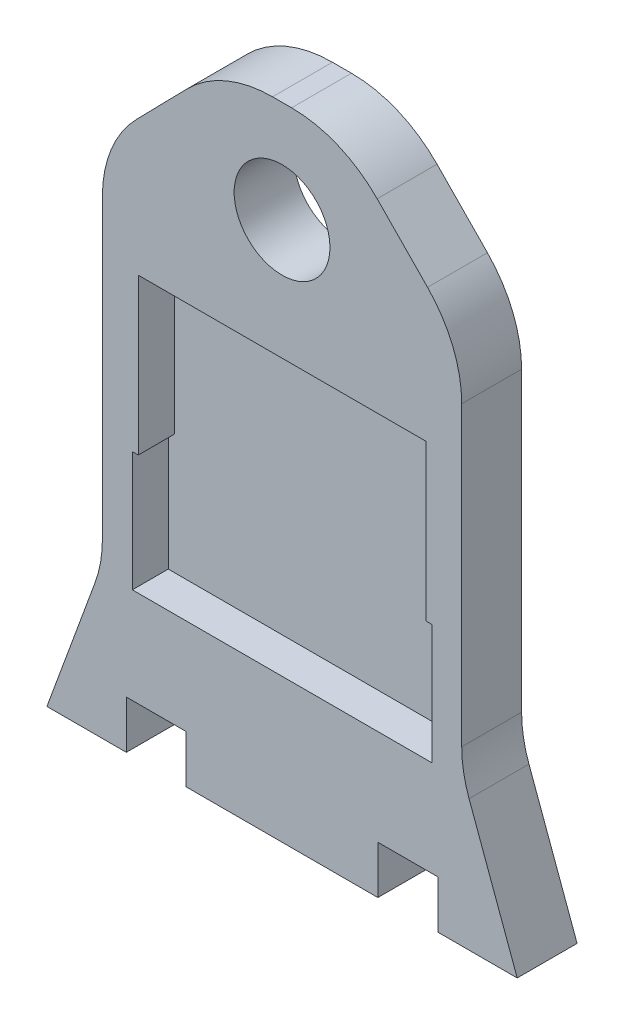
ISO-10303-21;
HEADER;
FILE_DESCRIPTION(('STEP AP214'),'2;1');
FILE_NAME('part.step','',(''),(''),'','','');
FILE_SCHEMA(('AUTOMOTIVE_DESIGN { 1 0 10303 214 1 1 1 1 }'));
ENDSEC;
DATA;
#1=APPLICATION_CONTEXT('core data for automotive mechanical design processes');
#2=APPLICATION_PROTOCOL_DEFINITION('international standard','automotive_design',2000,#1);
#3=PRODUCT_CONTEXT('',#1,'mechanical');
#4=PRODUCT('Part','Part','',(#3));
#5=PRODUCT_RELATED_PRODUCT_CATEGORY('part','',(#4));
#6=PRODUCT_DEFINITION_FORMATION('','',#4);
#7=PRODUCT_DEFINITION_CONTEXT('part definition',#1,'design');
#8=PRODUCT_DEFINITION('design','',#6,#7);
#9=PRODUCT_DEFINITION_SHAPE('','',#8);
#10=(LENGTH_UNIT() NAMED_UNIT(*) SI_UNIT(.MILLI.,.METRE.));
#11=(NAMED_UNIT(*) PLANE_ANGLE_UNIT() SI_UNIT($,.RADIAN.));
#12=(NAMED_UNIT(*) SI_UNIT($,.STERADIAN.) SOLID_ANGLE_UNIT());
#13=UNCERTAINTY_MEASURE_WITH_UNIT(LENGTH_MEASURE(1.E-05),#10,'distance_accuracy_value','');
#14=(GEOMETRIC_REPRESENTATION_CONTEXT(3) GLOBAL_UNCERTAINTY_ASSIGNED_CONTEXT((#13)) GLOBAL_UNIT_ASSIGNED_CONTEXT((#10,
#11,#12)) REPRESENTATION_CONTEXT('',''));
#15=CARTESIAN_POINT('',(0.,0.,0.));
#16=DIRECTION('',(0.,0.,1.));
#17=DIRECTION('',(1.,0.,0.));
#18=AXIS2_PLACEMENT_3D('',#15,#16,#17);
#19=CARTESIAN_POINT('',(0.,0.,5.));
#20=DIRECTION('',(0.,0.,-1.));
#21=DIRECTION('',(-1.,0.,0.));
#22=AXIS2_PLACEMENT_3D('',#19,#20,#21);
#23=PLANE('',#22);
#24=CARTESIAN_POINT('',(0.,12.5,5.));
#25=DIRECTION('',(0.,0.,1.));
#26=DIRECTION('',(1.,0.,0.));
#27=AXIS2_PLACEMENT_3D('',#24,#25,#26);
#28=CIRCLE('',#27,4.);
#29=CARTESIAN_POINT('',(4.,12.5,5.));
#30=VERTEX_POINT('',#29);
#31=EDGE_CURVE('E393',#30,#30,#28,.T.);
#32=ORIENTED_EDGE('',*,*,#31,.F.);
#33=EDGE_LOOP('',(#32));
#34=FACE_BOUND('',#33,.T.);
#35=DIRECTION('',(-0.344507703036126,0.938783490773444,0.));
#36=VECTOR('',#35,1.);
#37=CARTESIAN_POINT('',(15.,-19.875,5.));
#38=LINE('',#37,#36);
#39=CARTESIAN_POINT('',(19.6330275229358,-32.5,5.));
#40=VERTEX_POINT('',#39);
#41=CARTESIAN_POINT('',(15.6121650922656,-21.5431498764237,5.));
#42=VERTEX_POINT('',#41);
#43=EDGE_CURVE('E336',#40,#42,#38,.T.);
#44=ORIENTED_EDGE('',*,*,#43,.T.);
#45=CARTESIAN_POINT('',(25.,-18.0980728460624,5.));
#46=DIRECTION('',(0.,0.,-1.));
#47=DIRECTION('',(-1.,0.,0.));
#48=AXIS2_PLACEMENT_3D('',#45,#46,#47);
#49=CIRCLE('',#48,10.);
#50=CARTESIAN_POINT('',(15.,-18.0980728460624,5.));
#51=VERTEX_POINT('',#50);
#52=EDGE_CURVE('E45',#42,#51,#49,.T.);
#53=ORIENTED_EDGE('',*,*,#52,.T.);
#54=DIRECTION('',(0.,1.,0.));
#55=VECTOR('',#54,1.);
#56=CARTESIAN_POINT('',(15.,-33.5,5.));
#57=LINE('',#56,#55);
#58=CARTESIAN_POINT('',(15.,6.70234804023753,5.));
#59=VERTEX_POINT('',#58);
#60=EDGE_CURVE('E399',#51,#59,#57,.T.);
#61=ORIENTED_EDGE('',*,*,#60,.T.);
#62=CARTESIAN_POINT('',(5.,6.70234804023753,5.));
#63=DIRECTION('',(0.,0.,-1.));
#64=DIRECTION('',(-1.,0.,0.));
#65=AXIS2_PLACEMENT_3D('',#62,#63,#64);
#66=CIRCLE('',#65,10.);
#67=CARTESIAN_POINT('',(12.1471525735543,13.6965034638992,5.));
#68=VERTEX_POINT('',#67);
#69=EDGE_CURVE('E419',#59,#68,#66,.F.);
#70=ORIENTED_EDGE('',*,*,#69,.T.);
#71=DIRECTION('',(0.699415542366169,-0.714715257355429,0.));
#72=VECTOR('',#71,1.);
#73=CARTESIAN_POINT('',(15.,10.78125,5.));
#74=LINE('',#73,#72);
#75=CARTESIAN_POINT('',(7.94149927959712,17.9941554236617,5.));
#76=VERTEX_POINT('',#75);
#77=EDGE_CURVE('E331',#76,#68,#74,.T.);
#78=ORIENTED_EDGE('',*,*,#77,.F.);
#79=CARTESIAN_POINT('',(0.794346706042831,11.,5.));
#80=DIRECTION('',(0.,0.,-1.));
#81=DIRECTION('',(-1.,0.,0.));
#82=AXIS2_PLACEMENT_3D('',#79,#80,#81);
#83=CIRCLE('',#82,10.);
#84=CARTESIAN_POINT('',(0.794346706042831,21.,5.));
#85=VERTEX_POINT('',#84);
#86=EDGE_CURVE('E415',#76,#85,#83,.F.);
#87=ORIENTED_EDGE('',*,*,#86,.T.);
#88=DIRECTION('',(1.,0.,0.));
#89=VECTOR('',#88,1.);
#90=CARTESIAN_POINT('',(-15.,21.,5.));
#91=LINE('',#90,#89);
#92=CARTESIAN_POINT('',(-0.794346706042826,21.,5.));
#93=VERTEX_POINT('',#92);
#94=EDGE_CURVE('E365',#93,#85,#91,.T.);
#95=ORIENTED_EDGE('',*,*,#94,.F.);
#96=CARTESIAN_POINT('',(-0.794346706042825,11.,5.));
#97=DIRECTION('',(0.,0.,-1.));
#98=DIRECTION('',(-1.,0.,0.));
#99=AXIS2_PLACEMENT_3D('',#96,#97,#98);
#100=CIRCLE('',#99,10.);
#101=CARTESIAN_POINT('',(-7.94149927959712,17.9941554236617,5.));
#102=VERTEX_POINT('',#101);
#103=EDGE_CURVE('E413',#93,#102,#100,.F.);
#104=ORIENTED_EDGE('',*,*,#103,.T.);
#105=DIRECTION('',(0.699415542366169,0.714715257355429,0.));
#106=VECTOR('',#105,1.);
#107=CARTESIAN_POINT('',(-15.,10.78125,5.));
#108=LINE('',#107,#106);
#109=CARTESIAN_POINT('',(-12.1471525735543,13.6965034638992,5.));
#110=VERTEX_POINT('',#109);
#111=EDGE_CURVE('E328',#110,#102,#108,.T.);
#112=ORIENTED_EDGE('',*,*,#111,.F.);
#113=CARTESIAN_POINT('',(-5.,6.70234804023752,5.));
#114=DIRECTION('',(0.,0.,-1.));
#115=DIRECTION('',(-1.,0.,0.));
#116=AXIS2_PLACEMENT_3D('',#113,#114,#115);
#117=CIRCLE('',#116,10.);
#118=CARTESIAN_POINT('',(-15.,6.70234804023752,5.));
#119=VERTEX_POINT('',#118);
#120=EDGE_CURVE('E417',#110,#119,#117,.F.);
#121=ORIENTED_EDGE('',*,*,#120,.T.);
#122=DIRECTION('',(0.,-1.,0.));
#123=VECTOR('',#122,1.);
#124=CARTESIAN_POINT('',(-15.,-33.5,5.));
#125=LINE('',#124,#123);
#126=CARTESIAN_POINT('',(-15.,-18.0980728460624,5.));
#127=VERTEX_POINT('',#126);
#128=EDGE_CURVE('E401',#119,#127,#125,.T.);
#129=ORIENTED_EDGE('',*,*,#128,.T.);
#130=CARTESIAN_POINT('',(-25.,-18.0980728460624,5.));
#131=DIRECTION('',(0.,0.,-1.));
#132=DIRECTION('',(-1.,0.,0.));
#133=AXIS2_PLACEMENT_3D('',#130,#131,#132);
#134=CIRCLE('',#133,10.);
#135=CARTESIAN_POINT('',(-15.6121650922656,-21.5431498764237,5.));
#136=VERTEX_POINT('',#135);
#137=EDGE_CURVE('E457',#127,#136,#134,.T.);
#138=ORIENTED_EDGE('',*,*,#137,.T.);
#139=DIRECTION('',(-0.344507703036126,-0.938783490773444,0.));
#140=VECTOR('',#139,1.);
#141=CARTESIAN_POINT('',(-15.,-19.875,5.));
#142=LINE('',#141,#140);
#143=CARTESIAN_POINT('',(-19.6330275229358,-32.5,5.));
#144=VERTEX_POINT('',#143);
#145=EDGE_CURVE('E338',#136,#144,#142,.T.);
#146=ORIENTED_EDGE('',*,*,#145,.T.);
#147=DIRECTION('',(-1.,0.,0.));
#148=VECTOR('',#147,1.);
#149=CARTESIAN_POINT('',(-20.,-32.5,5.));
#150=LINE('',#149,#148);
#151=CARTESIAN_POINT('',(-13.,-32.5,5.));
#152=VERTEX_POINT('',#151);
#153=EDGE_CURVE('E287',#152,#144,#150,.T.);
#154=ORIENTED_EDGE('',*,*,#153,.F.);
#155=DIRECTION('',(0.,-1.,0.));
#156=VECTOR('',#155,1.);
#157=CARTESIAN_POINT('',(-13.,-33.5,5.));
#158=LINE('',#157,#156);
#159=CARTESIAN_POINT('',(-13.,-28.5,5.));
#160=VERTEX_POINT('',#159);
#161=EDGE_CURVE('E373',#160,#152,#158,.T.);
#162=ORIENTED_EDGE('',*,*,#161,.F.);
#163=DIRECTION('',(-1.,0.,0.));
#164=VECTOR('',#163,1.);
#165=CARTESIAN_POINT('',(-13.,-28.5,5.));
#166=LINE('',#165,#164);
#167=CARTESIAN_POINT('',(-8.,-28.5,5.));
#168=VERTEX_POINT('',#167);
#169=EDGE_CURVE('E376',#168,#160,#166,.T.);
#170=ORIENTED_EDGE('',*,*,#169,.F.);
#171=DIRECTION('',(0.,1.,0.));
#172=VECTOR('',#171,1.);
#173=CARTESIAN_POINT('',(-8.,-33.5,5.));
#174=LINE('',#173,#172);
#175=CARTESIAN_POINT('',(-8.,-32.5,5.));
#176=VERTEX_POINT('',#175);
#177=EDGE_CURVE('E359',#176,#168,#174,.T.);
#178=ORIENTED_EDGE('',*,*,#177,.F.);
#179=CARTESIAN_POINT('',(8.,-32.5,5.));
#180=VERTEX_POINT('',#179);
#181=EDGE_CURVE('E307',#180,#176,#150,.T.);
#182=ORIENTED_EDGE('',*,*,#181,.F.);
#183=DIRECTION('',(0.,-1.,0.));
#184=VECTOR('',#183,1.);
#185=CARTESIAN_POINT('',(8.,-33.5,5.));
#186=LINE('',#185,#184);
#187=CARTESIAN_POINT('',(8.,-28.5,5.));
#188=VERTEX_POINT('',#187);
#189=EDGE_CURVE('E355',#188,#180,#186,.T.);
#190=ORIENTED_EDGE('',*,*,#189,.F.);
#191=DIRECTION('',(-1.,0.,0.));
#192=VECTOR('',#191,1.);
#193=CARTESIAN_POINT('',(8.,-28.5,5.));
#194=LINE('',#193,#192);
#195=CARTESIAN_POINT('',(13.,-28.5,5.));
#196=VERTEX_POINT('',#195);
#197=EDGE_CURVE('E349',#196,#188,#194,.T.);
#198=ORIENTED_EDGE('',*,*,#197,.F.);
#199=DIRECTION('',(0.,1.,0.));
#200=VECTOR('',#199,1.);
#201=CARTESIAN_POINT('',(13.,-33.5,5.));
#202=LINE('',#201,#200);
#203=CARTESIAN_POINT('',(13.,-32.5,5.));
#204=VERTEX_POINT('',#203);
#205=EDGE_CURVE('E358',#204,#196,#202,.T.);
#206=ORIENTED_EDGE('',*,*,#205,.F.);
#207=EDGE_CURVE('E303',#40,#204,#150,.T.);
#208=ORIENTED_EDGE('',*,*,#207,.F.);
#209=EDGE_LOOP('',(#44,#53,#61,#70,#78,#87,#95,#104,#112,#121,#129,#138,#146,#154,#162,#170,
#178,#182,#190,#198,#206,#208));
#210=FACE_BOUND('',#209,.T.);
#211=DIRECTION('',(0.,-1.,0.));
#212=VECTOR('',#211,1.);
#213=CARTESIAN_POINT('',(12.,0.,5.));
#214=LINE('',#213,#212);
#215=CARTESIAN_POINT('',(12.,2.50000000000001,5.));
#216=VERTEX_POINT('',#215);
#217=CARTESIAN_POINT('',(12.,-10.5,5.));
#218=VERTEX_POINT('',#217);
#219=EDGE_CURVE('E52',#216,#218,#214,.T.);
#220=ORIENTED_EDGE('',*,*,#219,.T.);
#221=DIRECTION('',(1.,0.,0.));
#222=VECTOR('',#221,1.);
#223=CARTESIAN_POINT('',(0.,-10.5,5.));
#224=LINE('',#223,#222);
#225=CARTESIAN_POINT('',(12.5,-10.5,5.));
#226=VERTEX_POINT('',#225);
#227=EDGE_CURVE('E253',#218,#226,#224,.T.);
#228=ORIENTED_EDGE('',*,*,#227,.T.);
#229=DIRECTION('',(0.,1.,0.));
#230=VECTOR('',#229,1.);
#231=CARTESIAN_POINT('',(12.5,0.,5.));
#232=LINE('',#231,#230);
#233=CARTESIAN_POINT('',(12.5,-20.5,5.));
#234=VERTEX_POINT('',#233);
#235=EDGE_CURVE('E256',#234,#226,#232,.T.);
#236=ORIENTED_EDGE('',*,*,#235,.F.);
#237=DIRECTION('',(1.,0.,0.));
#238=VECTOR('',#237,1.);
#239=CARTESIAN_POINT('',(0.,-20.5,5.));
#240=LINE('',#239,#238);
#241=CARTESIAN_POINT('',(-12.5,-20.5,5.));
#242=VERTEX_POINT('',#241);
#243=EDGE_CURVE('E280',#242,#234,#240,.T.);
#244=ORIENTED_EDGE('',*,*,#243,.F.);
#245=DIRECTION('',(0.,1.,0.));
#246=VECTOR('',#245,1.);
#247=CARTESIAN_POINT('',(-12.5,0.,5.));
#248=LINE('',#247,#246);
#249=CARTESIAN_POINT('',(-12.5,-10.5,5.));
#250=VERTEX_POINT('',#249);
#251=EDGE_CURVE('E277',#242,#250,#248,.T.);
#252=ORIENTED_EDGE('',*,*,#251,.T.);
#253=CARTESIAN_POINT('',(-12.,-10.5,5.));
#254=VERTEX_POINT('',#253);
#255=EDGE_CURVE('E258',#250,#254,#224,.T.);
#256=ORIENTED_EDGE('',*,*,#255,.T.);
#257=DIRECTION('',(0.,-1.,0.));
#258=VECTOR('',#257,1.);
#259=CARTESIAN_POINT('',(-12.,0.,5.));
#260=LINE('',#259,#258);
#261=CARTESIAN_POINT('',(-12.,2.50000000000001,5.));
#262=VERTEX_POINT('',#261);
#263=EDGE_CURVE('E273',#262,#254,#260,.T.);
#264=ORIENTED_EDGE('',*,*,#263,.F.);
#265=DIRECTION('',(1.,0.,0.));
#266=VECTOR('',#265,1.);
#267=CARTESIAN_POINT('',(0.,2.50000000000001,5.));
#268=LINE('',#267,#266);
#269=EDGE_CURVE('E271',#262,#216,#268,.T.);
#270=ORIENTED_EDGE('',*,*,#269,.T.);
#271=EDGE_LOOP('',(#220,#228,#236,#244,#252,#256,#264,#270));
#272=FACE_BOUND('',#271,.T.);
#273=ADVANCED_FACE('F37',(#34,#210,#272),#23,.F.);
#274=CARTESIAN_POINT('',(15.,-33.5,5.));
#275=DIRECTION('',(-1.,0.,0.));
#276=DIRECTION('',(0.,0.,1.));
#277=AXIS2_PLACEMENT_3D('',#274,#275,#276);
#278=PLANE('',#277);
#279=ORIENTED_EDGE('',*,*,#60,.F.);
#280=DIRECTION('',(0.,0.,1.));
#281=VECTOR('',#280,1.);
#282=CARTESIAN_POINT('',(15.,-18.0980728460624,5.));
#283=LINE('',#282,#281);
#284=CARTESIAN_POINT('',(15.,-18.0980728460624,0.));
#285=VERTEX_POINT('',#284);
#286=EDGE_CURVE('E455',#51,#285,#283,.F.);
#287=ORIENTED_EDGE('',*,*,#286,.T.);
#288=DIRECTION('',(0.,1.,0.));
#289=VECTOR('',#288,1.);
#290=CARTESIAN_POINT('',(15.,-33.5,0.));
#291=LINE('',#290,#289);
#292=CARTESIAN_POINT('',(15.,6.70234804023753,0.));
#293=VERTEX_POINT('',#292);
#294=EDGE_CURVE('E396',#285,#293,#291,.T.);
#295=ORIENTED_EDGE('',*,*,#294,.T.);
#296=DIRECTION('',(0.,0.,1.));
#297=VECTOR('',#296,1.);
#298=CARTESIAN_POINT('',(15.,6.70234804023753,5.));
#299=LINE('',#298,#297);
#300=EDGE_CURVE('E410',#293,#59,#299,.T.);
#301=ORIENTED_EDGE('',*,*,#300,.T.);
#302=EDGE_LOOP('',(#279,#287,#295,#301));
#303=FACE_BOUND('',#302,.T.);
#304=ADVANCED_FACE('F528',(#303),#278,.F.);
#305=CARTESIAN_POINT('',(0.,0.,0.));
#306=DIRECTION('',(0.,0.,-1.));
#307=DIRECTION('',(-1.,0.,0.));
#308=AXIS2_PLACEMENT_3D('',#305,#306,#307);
#309=PLANE('',#308);
#310=DIRECTION('',(0.699415542366169,-0.714715257355429,0.));
#311=VECTOR('',#310,1.);
#312=CARTESIAN_POINT('',(15.,10.78125,0.));
#313=LINE('',#312,#311);
#314=CARTESIAN_POINT('',(7.94149927959712,17.9941554236617,0.));
#315=VERTEX_POINT('',#314);
#316=CARTESIAN_POINT('',(12.1471525735543,13.6965034638992,0.));
#317=VERTEX_POINT('',#316);
#318=EDGE_CURVE('E323',#315,#317,#313,.T.);
#319=ORIENTED_EDGE('',*,*,#318,.T.);
#320=CARTESIAN_POINT('',(5.,6.70234804023753,0.));
#321=DIRECTION('',(0.,0.,-1.));
#322=DIRECTION('',(-1.,0.,0.));
#323=AXIS2_PLACEMENT_3D('',#320,#321,#322);
#324=CIRCLE('',#323,10.);
#325=EDGE_CURVE('E432',#317,#293,#324,.T.);
#326=ORIENTED_EDGE('',*,*,#325,.T.);
#327=ORIENTED_EDGE('',*,*,#294,.F.);
#328=CARTESIAN_POINT('',(25.,-18.0980728460624,0.));
#329=DIRECTION('',(0.,0.,-1.));
#330=DIRECTION('',(-1.,0.,0.));
#331=AXIS2_PLACEMENT_3D('',#328,#329,#330);
#332=CIRCLE('',#331,10.);
#333=CARTESIAN_POINT('',(15.6121650922656,-21.5431498764237,0.));
#334=VERTEX_POINT('',#333);
#335=EDGE_CURVE('E11',#285,#334,#332,.F.);
#336=ORIENTED_EDGE('',*,*,#335,.T.);
#337=DIRECTION('',(-0.344507703036126,0.938783490773444,0.));
#338=VECTOR('',#337,1.);
#339=CARTESIAN_POINT('',(15.,-19.875,0.));
#340=LINE('',#339,#338);
#341=CARTESIAN_POINT('',(19.6330275229358,-32.5,0.));
#342=VERTEX_POINT('',#341);
#343=EDGE_CURVE('E327',#342,#334,#340,.T.);
#344=ORIENTED_EDGE('',*,*,#343,.F.);
#345=DIRECTION('',(-1.,0.,0.));
#346=VECTOR('',#345,1.);
#347=CARTESIAN_POINT('',(-20.,-32.5,0.));
#348=LINE('',#347,#346);
#349=CARTESIAN_POINT('',(13.,-32.5,0.));
#350=VERTEX_POINT('',#349);
#351=EDGE_CURVE('E304',#342,#350,#348,.T.);
#352=ORIENTED_EDGE('',*,*,#351,.T.);
#353=DIRECTION('',(0.,1.,0.));
#354=VECTOR('',#353,1.);
#355=CARTESIAN_POINT('',(13.,-33.5,0.));
#356=LINE('',#355,#354);
#357=CARTESIAN_POINT('',(13.,-28.5,0.));
#358=VERTEX_POINT('',#357);
#359=EDGE_CURVE('E348',#350,#358,#356,.T.);
#360=ORIENTED_EDGE('',*,*,#359,.T.);
#361=DIRECTION('',(-1.,0.,0.));
#362=VECTOR('',#361,1.);
#363=CARTESIAN_POINT('',(8.,-28.5,0.));
#364=LINE('',#363,#362);
#365=CARTESIAN_POINT('',(8.,-28.5,0.));
#366=VERTEX_POINT('',#365);
#367=EDGE_CURVE('E351',#358,#366,#364,.T.);
#368=ORIENTED_EDGE('',*,*,#367,.T.);
#369=DIRECTION('',(0.,-1.,0.));
#370=VECTOR('',#369,1.);
#371=CARTESIAN_POINT('',(8.,-33.5,0.));
#372=LINE('',#371,#370);
#373=CARTESIAN_POINT('',(8.,-32.5,0.));
#374=VERTEX_POINT('',#373);
#375=EDGE_CURVE('E345',#366,#374,#372,.T.);
#376=ORIENTED_EDGE('',*,*,#375,.T.);
#377=CARTESIAN_POINT('',(-8.,-32.5,0.));
#378=VERTEX_POINT('',#377);
#379=EDGE_CURVE('E302',#374,#378,#348,.T.);
#380=ORIENTED_EDGE('',*,*,#379,.T.);
#381=DIRECTION('',(0.,1.,0.));
#382=VECTOR('',#381,1.);
#383=CARTESIAN_POINT('',(-8.,-33.5,0.));
#384=LINE('',#383,#382);
#385=CARTESIAN_POINT('',(-8.,-28.5,0.));
#386=VERTEX_POINT('',#385);
#387=EDGE_CURVE('E377',#378,#386,#384,.T.);
#388=ORIENTED_EDGE('',*,*,#387,.T.);
#389=DIRECTION('',(-1.,0.,0.));
#390=VECTOR('',#389,1.);
#391=CARTESIAN_POINT('',(-13.,-28.5,0.));
#392=LINE('',#391,#390);
#393=CARTESIAN_POINT('',(-13.,-28.5,0.));
#394=VERTEX_POINT('',#393);
#395=EDGE_CURVE('E383',#386,#394,#392,.T.);
#396=ORIENTED_EDGE('',*,*,#395,.T.);
#397=DIRECTION('',(0.,-1.,0.));
#398=VECTOR('',#397,1.);
#399=CARTESIAN_POINT('',(-13.,-33.5,0.));
#400=LINE('',#399,#398);
#401=CARTESIAN_POINT('',(-13.,-32.5,0.));
#402=VERTEX_POINT('',#401);
#403=EDGE_CURVE('E371',#394,#402,#400,.T.);
#404=ORIENTED_EDGE('',*,*,#403,.T.);
#405=CARTESIAN_POINT('',(-19.6330275229358,-32.5,0.));
#406=VERTEX_POINT('',#405);
#407=EDGE_CURVE('E299',#402,#406,#348,.T.);
#408=ORIENTED_EDGE('',*,*,#407,.T.);
#409=DIRECTION('',(-0.344507703036126,-0.938783490773444,0.));
#410=VECTOR('',#409,1.);
#411=CARTESIAN_POINT('',(-15.,-19.875,0.));
#412=LINE('',#411,#410);
#413=CARTESIAN_POINT('',(-15.6121650922656,-21.5431498764237,0.));
#414=VERTEX_POINT('',#413);
#415=EDGE_CURVE('E341',#414,#406,#412,.T.);
#416=ORIENTED_EDGE('',*,*,#415,.F.);
#417=CARTESIAN_POINT('',(-25.,-18.0980728460624,0.));
#418=DIRECTION('',(0.,0.,-1.));
#419=DIRECTION('',(-1.,0.,0.));
#420=AXIS2_PLACEMENT_3D('',#417,#418,#419);
#421=CIRCLE('',#420,10.);
#422=CARTESIAN_POINT('',(-15.,-18.0980728460624,0.));
#423=VERTEX_POINT('',#422);
#424=EDGE_CURVE('E459',#414,#423,#421,.F.);
#425=ORIENTED_EDGE('',*,*,#424,.T.);
#426=DIRECTION('',(0.,-1.,0.));
#427=VECTOR('',#426,1.);
#428=CARTESIAN_POINT('',(-15.,-33.5,0.));
#429=LINE('',#428,#427);
#430=CARTESIAN_POINT('',(-15.,6.70234804023752,0.));
#431=VERTEX_POINT('',#430);
#432=EDGE_CURVE('E402',#431,#423,#429,.T.);
#433=ORIENTED_EDGE('',*,*,#432,.F.);
#434=CARTESIAN_POINT('',(-5.,6.70234804023752,0.));
#435=DIRECTION('',(0.,0.,-1.));
#436=DIRECTION('',(-1.,0.,0.));
#437=AXIS2_PLACEMENT_3D('',#434,#435,#436);
#438=CIRCLE('',#437,10.);
#439=CARTESIAN_POINT('',(-12.1471525735543,13.6965034638992,0.));
#440=VERTEX_POINT('',#439);
#441=EDGE_CURVE('E430',#431,#440,#438,.T.);
#442=ORIENTED_EDGE('',*,*,#441,.T.);
#443=DIRECTION('',(0.699415542366169,0.714715257355429,0.));
#444=VECTOR('',#443,1.);
#445=CARTESIAN_POINT('',(-15.,10.78125,0.));
#446=LINE('',#445,#444);
#447=CARTESIAN_POINT('',(-7.94149927959712,17.9941554236617,0.));
#448=VERTEX_POINT('',#447);
#449=EDGE_CURVE('E324',#440,#448,#446,.T.);
#450=ORIENTED_EDGE('',*,*,#449,.T.);
#451=CARTESIAN_POINT('',(-0.794346706042825,11.,0.));
#452=DIRECTION('',(0.,0.,-1.));
#453=DIRECTION('',(-1.,0.,0.));
#454=AXIS2_PLACEMENT_3D('',#451,#452,#453);
#455=CIRCLE('',#454,10.);
#456=CARTESIAN_POINT('',(-0.794346706042826,21.,0.));
#457=VERTEX_POINT('',#456);
#458=EDGE_CURVE('E426',#448,#457,#455,.T.);
#459=ORIENTED_EDGE('',*,*,#458,.T.);
#460=DIRECTION('',(1.,0.,0.));
#461=VECTOR('',#460,1.);
#462=CARTESIAN_POINT('',(-15.,21.,0.));
#463=LINE('',#462,#461);
#464=CARTESIAN_POINT('',(0.794346706042831,21.,0.));
#465=VERTEX_POINT('',#464);
#466=EDGE_CURVE('E387',#457,#465,#463,.T.);
#467=ORIENTED_EDGE('',*,*,#466,.T.);
#468=CARTESIAN_POINT('',(0.794346706042831,11.,0.));
#469=DIRECTION('',(0.,0.,-1.));
#470=DIRECTION('',(-1.,0.,0.));
#471=AXIS2_PLACEMENT_3D('',#468,#469,#470);
#472=CIRCLE('',#471,10.);
#473=EDGE_CURVE('E428',#465,#315,#472,.T.);
#474=ORIENTED_EDGE('',*,*,#473,.T.);
#475=EDGE_LOOP('',(#319,#326,#327,#336,#344,#352,#360,#368,#376,#380,#388,#396,#404,#408,#416,
#425,#433,#442,#450,#459,#467,#474));
#476=FACE_BOUND('',#475,.T.);
#477=CARTESIAN_POINT('',(0.,12.5,0.));
#478=DIRECTION('',(0.,0.,1.));
#479=DIRECTION('',(1.,0.,0.));
#480=AXIS2_PLACEMENT_3D('',#477,#478,#479);
#481=CIRCLE('',#480,4.);
#482=CARTESIAN_POINT('',(4.,12.5,0.));
#483=VERTEX_POINT('',#482);
#484=EDGE_CURVE('E390',#483,#483,#481,.T.);
#485=ORIENTED_EDGE('',*,*,#484,.T.);
#486=EDGE_LOOP('',(#485));
#487=FACE_BOUND('',#486,.T.);
#488=ADVANCED_FACE('F464',(#476,#487),#309,.T.);
#489=CARTESIAN_POINT('',(-15.,-33.5,5.));
#490=DIRECTION('',(1.,0.,0.));
#491=DIRECTION('',(0.,0.,-1.));
#492=AXIS2_PLACEMENT_3D('',#489,#490,#491);
#493=PLANE('',#492);
#494=ORIENTED_EDGE('',*,*,#432,.T.);
#495=DIRECTION('',(0.,0.,1.));
#496=VECTOR('',#495,1.);
#497=CARTESIAN_POINT('',(-15.,-18.0980728460624,5.));
#498=LINE('',#497,#496);
#499=EDGE_CURVE('E447',#423,#127,#498,.T.);
#500=ORIENTED_EDGE('',*,*,#499,.T.);
#501=ORIENTED_EDGE('',*,*,#128,.F.);
#502=DIRECTION('',(0.,0.,1.));
#503=VECTOR('',#502,1.);
#504=CARTESIAN_POINT('',(-15.,6.70234804023752,5.));
#505=LINE('',#504,#503);
#506=EDGE_CURVE('E440',#119,#431,#505,.F.);
#507=ORIENTED_EDGE('',*,*,#506,.T.);
#508=EDGE_LOOP('',(#494,#500,#501,#507));
#509=FACE_BOUND('',#508,.T.);
#510=ADVANCED_FACE('F471',(#509),#493,.F.);
#511=CARTESIAN_POINT('',(0.,12.5,5.));
#512=DIRECTION('',(0.,0.,-1.));
#513=DIRECTION('',(-1.,0.,0.));
#514=AXIS2_PLACEMENT_3D('',#511,#512,#513);
#515=CYLINDRICAL_SURFACE('',#514,4.);
#516=ORIENTED_EDGE('',*,*,#31,.T.);
#517=EDGE_LOOP('',(#516));
#518=FACE_BOUND('',#517,.T.);
#519=ORIENTED_EDGE('',*,*,#484,.F.);
#520=EDGE_LOOP('',(#519));
#521=FACE_BOUND('',#520,.T.);
#522=ADVANCED_FACE('F580',(#518,#521),#515,.F.);
#523=CARTESIAN_POINT('',(-15.,21.,0.));
#524=DIRECTION('',(0.,-1.,0.));
#525=DIRECTION('',(1.,0.,0.));
#526=AXIS2_PLACEMENT_3D('',#523,#524,#525);
#527=PLANE('',#526);
#528=ORIENTED_EDGE('',*,*,#94,.T.);
#529=DIRECTION('',(0.,0.,1.));
#530=VECTOR('',#529,1.);
#531=CARTESIAN_POINT('',(0.794346706042831,21.,0.));
#532=LINE('',#531,#530);
#533=EDGE_CURVE('E445',#85,#465,#532,.F.);
#534=ORIENTED_EDGE('',*,*,#533,.T.);
#535=ORIENTED_EDGE('',*,*,#466,.F.);
#536=DIRECTION('',(0.,0.,1.));
#537=VECTOR('',#536,1.);
#538=CARTESIAN_POINT('',(-0.794346706042826,21.,0.));
#539=LINE('',#538,#537);
#540=EDGE_CURVE('E442',#457,#93,#539,.T.);
#541=ORIENTED_EDGE('',*,*,#540,.T.);
#542=EDGE_LOOP('',(#528,#534,#535,#541));
#543=FACE_BOUND('',#542,.T.);
#544=ADVANCED_FACE('F546',(#543),#527,.F.);
#545=CARTESIAN_POINT('',(-8.,-33.5,0.));
#546=DIRECTION('',(1.,0.,0.));
#547=DIRECTION('',(0.,0.,-1.));
#548=AXIS2_PLACEMENT_3D('',#545,#546,#547);
#549=PLANE('',#548);
#550=ORIENTED_EDGE('',*,*,#387,.F.);
#551=DIRECTION('',(0.,0.,1.));
#552=VECTOR('',#551,1.);
#553=CARTESIAN_POINT('',(-8.,-32.5,0.));
#554=LINE('',#553,#552);
#555=EDGE_CURVE('E320',#378,#176,#554,.T.);
#556=ORIENTED_EDGE('',*,*,#555,.T.);
#557=ORIENTED_EDGE('',*,*,#177,.T.);
#558=DIRECTION('',(0.,0.,1.));
#559=VECTOR('',#558,1.);
#560=CARTESIAN_POINT('',(-8.,-28.5,0.));
#561=LINE('',#560,#559);
#562=EDGE_CURVE('E368',#386,#168,#561,.T.);
#563=ORIENTED_EDGE('',*,*,#562,.F.);
#564=EDGE_LOOP('',(#550,#556,#557,#563));
#565=FACE_BOUND('',#564,.T.);
#566=ADVANCED_FACE('F496',(#565),#549,.F.);
#567=CARTESIAN_POINT('',(-13.,-33.5,0.));
#568=DIRECTION('',(-1.,0.,0.));
#569=DIRECTION('',(0.,0.,1.));
#570=AXIS2_PLACEMENT_3D('',#567,#568,#569);
#571=PLANE('',#570);
#572=ORIENTED_EDGE('',*,*,#161,.T.);
#573=DIRECTION('',(0.,0.,-1.));
#574=VECTOR('',#573,1.);
#575=CARTESIAN_POINT('',(-13.,-32.5,0.));
#576=LINE('',#575,#574);
#577=EDGE_CURVE('E317',#152,#402,#576,.T.);
#578=ORIENTED_EDGE('',*,*,#577,.T.);
#579=ORIENTED_EDGE('',*,*,#403,.F.);
#580=DIRECTION('',(0.,0.,1.));
#581=VECTOR('',#580,1.);
#582=CARTESIAN_POINT('',(-13.,-28.5,0.));
#583=LINE('',#582,#581);
#584=EDGE_CURVE('E343',#394,#160,#583,.T.);
#585=ORIENTED_EDGE('',*,*,#584,.T.);
#586=EDGE_LOOP('',(#572,#578,#579,#585));
#587=FACE_BOUND('',#586,.T.);
#588=ADVANCED_FACE('F486',(#587),#571,.F.);
#589=CARTESIAN_POINT('',(-13.,-28.5,0.));
#590=DIRECTION('',(0.,1.,0.));
#591=DIRECTION('',(0.,0.,1.));
#592=AXIS2_PLACEMENT_3D('',#589,#590,#591);
#593=PLANE('',#592);
#594=ORIENTED_EDGE('',*,*,#169,.T.);
#595=ORIENTED_EDGE('',*,*,#584,.F.);
#596=ORIENTED_EDGE('',*,*,#395,.F.);
#597=ORIENTED_EDGE('',*,*,#562,.T.);
#598=EDGE_LOOP('',(#594,#595,#596,#597));
#599=FACE_BOUND('',#598,.T.);
#600=ADVANCED_FACE('F492',(#599),#593,.F.);
#601=CARTESIAN_POINT('',(8.,-33.5,0.));
#602=DIRECTION('',(-1.,0.,0.));
#603=DIRECTION('',(0.,0.,1.));
#604=AXIS2_PLACEMENT_3D('',#601,#602,#603);
#605=PLANE('',#604);
#606=ORIENTED_EDGE('',*,*,#189,.T.);
#607=DIRECTION('',(0.,0.,-1.));
#608=VECTOR('',#607,1.);
#609=CARTESIAN_POINT('',(8.,-32.5,0.));
#610=LINE('',#609,#608);
#611=EDGE_CURVE('E314',#180,#374,#610,.T.);
#612=ORIENTED_EDGE('',*,*,#611,.T.);
#613=ORIENTED_EDGE('',*,*,#375,.F.);
#614=DIRECTION('',(0.,0.,1.));
#615=VECTOR('',#614,1.);
#616=CARTESIAN_POINT('',(8.,-28.5,0.));
#617=LINE('',#616,#615);
#618=EDGE_CURVE('E363',#366,#188,#617,.T.);
#619=ORIENTED_EDGE('',*,*,#618,.T.);
#620=EDGE_LOOP('',(#606,#612,#613,#619));
#621=FACE_BOUND('',#620,.T.);
#622=ADVANCED_FACE('F516',(#621),#605,.F.);
#623=CARTESIAN_POINT('',(8.,-28.5,0.));
#624=DIRECTION('',(0.,1.,0.));
#625=DIRECTION('',(0.,0.,1.));
#626=AXIS2_PLACEMENT_3D('',#623,#624,#625);
#627=PLANE('',#626);
#628=ORIENTED_EDGE('',*,*,#197,.T.);
#629=ORIENTED_EDGE('',*,*,#618,.F.);
#630=ORIENTED_EDGE('',*,*,#367,.F.);
#631=DIRECTION('',(0.,0.,1.));
#632=VECTOR('',#631,1.);
#633=CARTESIAN_POINT('',(13.,-28.5,0.));
#634=LINE('',#633,#632);
#635=EDGE_CURVE('E354',#358,#196,#634,.T.);
#636=ORIENTED_EDGE('',*,*,#635,.T.);
#637=EDGE_LOOP('',(#628,#629,#630,#636));
#638=FACE_BOUND('',#637,.T.);
#639=ADVANCED_FACE('F513',(#638),#627,.F.);
#640=CARTESIAN_POINT('',(13.,-33.5,0.));
#641=DIRECTION('',(1.,0.,0.));
#642=DIRECTION('',(0.,0.,-1.));
#643=AXIS2_PLACEMENT_3D('',#640,#641,#642);
#644=PLANE('',#643);
#645=ORIENTED_EDGE('',*,*,#359,.F.);
#646=DIRECTION('',(0.,0.,1.));
#647=VECTOR('',#646,1.);
#648=CARTESIAN_POINT('',(13.,-32.5,0.));
#649=LINE('',#648,#647);
#650=EDGE_CURVE('E311',#350,#204,#649,.T.);
#651=ORIENTED_EDGE('',*,*,#650,.T.);
#652=ORIENTED_EDGE('',*,*,#205,.T.);
#653=ORIENTED_EDGE('',*,*,#635,.F.);
#654=EDGE_LOOP('',(#645,#651,#652,#653));
#655=FACE_BOUND('',#654,.T.);
#656=ADVANCED_FACE('F508',(#655),#644,.F.);
#657=CARTESIAN_POINT('',(-15.,-19.875,0.));
#658=DIRECTION('',(-0.938783490773444,0.344507703036126,0.));
#659=DIRECTION('',(-0.344507703036126,-0.938783490773444,0.));
#660=AXIS2_PLACEMENT_3D('',#657,#658,#659);
#661=PLANE('',#660);
#662=ORIENTED_EDGE('',*,*,#145,.F.);
#663=DIRECTION('',(0.,0.,1.));
#664=VECTOR('',#663,1.);
#665=CARTESIAN_POINT('',(-15.6121650922656,-21.5431498764237,0.));
#666=LINE('',#665,#664);
#667=EDGE_CURVE('E450',#136,#414,#666,.F.);
#668=ORIENTED_EDGE('',*,*,#667,.T.);
#669=ORIENTED_EDGE('',*,*,#415,.T.);
#670=DIRECTION('',(0.,0.,-1.));
#671=VECTOR('',#670,1.);
#672=CARTESIAN_POINT('',(-19.6330275229358,-32.5,0.));
#673=LINE('',#672,#671);
#674=EDGE_CURVE('E308',#144,#406,#673,.T.);
#675=ORIENTED_EDGE('',*,*,#674,.F.);
#676=EDGE_LOOP('',(#662,#668,#669,#675));
#677=FACE_BOUND('',#676,.T.);
#678=ADVANCED_FACE('F480',(#677),#661,.T.);
#679=CARTESIAN_POINT('',(15.,-19.875,0.));
#680=DIRECTION('',(0.938783490773444,0.344507703036126,0.));
#681=DIRECTION('',(-0.344507703036126,0.938783490773444,0.));
#682=AXIS2_PLACEMENT_3D('',#679,#680,#681);
#683=PLANE('',#682);
#684=ORIENTED_EDGE('',*,*,#343,.T.);
#685=DIRECTION('',(0.,0.,1.));
#686=VECTOR('',#685,1.);
#687=CARTESIAN_POINT('',(15.6121650922656,-21.5431498764237,0.));
#688=LINE('',#687,#686);
#689=EDGE_CURVE('E452',#334,#42,#688,.T.);
#690=ORIENTED_EDGE('',*,*,#689,.T.);
#691=ORIENTED_EDGE('',*,*,#43,.F.);
#692=DIRECTION('',(0.,0.,1.));
#693=VECTOR('',#692,1.);
#694=CARTESIAN_POINT('',(19.6330275229358,-32.5,0.));
#695=LINE('',#694,#693);
#696=EDGE_CURVE('E405',#342,#40,#695,.T.);
#697=ORIENTED_EDGE('',*,*,#696,.F.);
#698=EDGE_LOOP('',(#684,#690,#691,#697));
#699=FACE_BOUND('',#698,.T.);
#700=ADVANCED_FACE('F521',(#699),#683,.T.);
#701=CARTESIAN_POINT('',(15.,10.78125,0.));
#702=DIRECTION('',(-0.714715257355429,-0.699415542366169,0.));
#703=DIRECTION('',(0.699415542366169,-0.714715257355429,0.));
#704=AXIS2_PLACEMENT_3D('',#701,#702,#703);
#705=PLANE('',#704);
#706=ORIENTED_EDGE('',*,*,#77,.T.);
#707=DIRECTION('',(0.,0.,1.));
#708=VECTOR('',#707,1.);
#709=CARTESIAN_POINT('',(12.1471525735543,13.6965034638992,0.));
#710=LINE('',#709,#708);
#711=EDGE_CURVE('E424',#68,#317,#710,.F.);
#712=ORIENTED_EDGE('',*,*,#711,.T.);
#713=ORIENTED_EDGE('',*,*,#318,.F.);
#714=DIRECTION('',(0.,0.,1.));
#715=VECTOR('',#714,1.);
#716=CARTESIAN_POINT('',(7.94149927959712,17.9941554236617,0.));
#717=LINE('',#716,#715);
#718=EDGE_CURVE('E421',#315,#76,#717,.T.);
#719=ORIENTED_EDGE('',*,*,#718,.T.);
#720=EDGE_LOOP('',(#706,#712,#713,#719));
#721=FACE_BOUND('',#720,.T.);
#722=ADVANCED_FACE('F538',(#721),#705,.F.);
#723=CARTESIAN_POINT('',(-15.,10.78125,0.));
#724=DIRECTION('',(0.714715257355429,-0.699415542366169,0.));
#725=DIRECTION('',(0.699415542366169,0.714715257355429,0.));
#726=AXIS2_PLACEMENT_3D('',#723,#724,#725);
#727=PLANE('',#726);
#728=ORIENTED_EDGE('',*,*,#449,.F.);
#729=DIRECTION('',(0.,0.,1.));
#730=VECTOR('',#729,1.);
#731=CARTESIAN_POINT('',(-12.1471525735543,13.6965034638992,0.));
#732=LINE('',#731,#730);
#733=EDGE_CURVE('E437',#440,#110,#732,.T.);
#734=ORIENTED_EDGE('',*,*,#733,.T.);
#735=ORIENTED_EDGE('',*,*,#111,.T.);
#736=DIRECTION('',(0.,0.,1.));
#737=VECTOR('',#736,1.);
#738=CARTESIAN_POINT('',(-7.94149927959712,17.9941554236617,0.));
#739=LINE('',#738,#737);
#740=EDGE_CURVE('E435',#102,#448,#739,.F.);
#741=ORIENTED_EDGE('',*,*,#740,.T.);
#742=EDGE_LOOP('',(#728,#734,#735,#741));
#743=FACE_BOUND('',#742,.T.);
#744=ADVANCED_FACE('F556',(#743),#727,.F.);
#745=CARTESIAN_POINT('',(-20.,-32.5,0.));
#746=DIRECTION('',(0.,1.,0.));
#747=DIRECTION('',(0.,0.,1.));
#748=AXIS2_PLACEMENT_3D('',#745,#746,#747);
#749=PLANE('',#748);
#750=ORIENTED_EDGE('',*,*,#351,.F.);
#751=ORIENTED_EDGE('',*,*,#696,.T.);
#752=ORIENTED_EDGE('',*,*,#207,.T.);
#753=ORIENTED_EDGE('',*,*,#650,.F.);
#754=EDGE_LOOP('',(#750,#751,#752,#753));
#755=FACE_BOUND('',#754,.T.);
#756=ADVANCED_FACE('F518',(#755),#749,.F.);
#757=ORIENTED_EDGE('',*,*,#153,.T.);
#758=ORIENTED_EDGE('',*,*,#674,.T.);
#759=ORIENTED_EDGE('',*,*,#407,.F.);
#760=ORIENTED_EDGE('',*,*,#577,.F.);
#761=EDGE_LOOP('',(#757,#758,#759,#760));
#762=FACE_BOUND('',#761,.T.);
#763=ADVANCED_FACE('F482',(#762),#749,.F.);
#764=ORIENTED_EDGE('',*,*,#379,.F.);
#765=ORIENTED_EDGE('',*,*,#611,.F.);
#766=ORIENTED_EDGE('',*,*,#181,.T.);
#767=ORIENTED_EDGE('',*,*,#555,.F.);
#768=EDGE_LOOP('',(#764,#765,#766,#767));
#769=FACE_BOUND('',#768,.T.);
#770=ADVANCED_FACE('F499',(#769),#749,.F.);
#771=CARTESIAN_POINT('',(5.,6.70234804023753,5.));
#772=DIRECTION('',(0.,0.,1.));
#773=DIRECTION('',(1.,0.,0.));
#774=AXIS2_PLACEMENT_3D('',#771,#772,#773);
#775=CYLINDRICAL_SURFACE('',#774,10.);
#776=ORIENTED_EDGE('',*,*,#325,.F.);
#777=ORIENTED_EDGE('',*,*,#711,.F.);
#778=ORIENTED_EDGE('',*,*,#69,.F.);
#779=ORIENTED_EDGE('',*,*,#300,.F.);
#780=EDGE_LOOP('',(#776,#777,#778,#779));
#781=FACE_BOUND('',#780,.T.);
#782=ADVANCED_FACE('F535',(#781),#775,.T.);
#783=CARTESIAN_POINT('',(-5.,6.70234804023752,0.));
#784=DIRECTION('',(0.,0.,1.));
#785=DIRECTION('',(1.,0.,0.));
#786=AXIS2_PLACEMENT_3D('',#783,#784,#785);
#787=CYLINDRICAL_SURFACE('',#786,10.);
#788=ORIENTED_EDGE('',*,*,#441,.F.);
#789=ORIENTED_EDGE('',*,*,#506,.F.);
#790=ORIENTED_EDGE('',*,*,#120,.F.);
#791=ORIENTED_EDGE('',*,*,#733,.F.);
#792=EDGE_LOOP('',(#788,#789,#790,#791));
#793=FACE_BOUND('',#792,.T.);
#794=ADVANCED_FACE('F559',(#793),#787,.T.);
#795=CARTESIAN_POINT('',(0.794346706042831,11.,0.));
#796=DIRECTION('',(0.,0.,1.));
#797=DIRECTION('',(1.,0.,0.));
#798=AXIS2_PLACEMENT_3D('',#795,#796,#797);
#799=CYLINDRICAL_SURFACE('',#798,10.);
#800=ORIENTED_EDGE('',*,*,#473,.F.);
#801=ORIENTED_EDGE('',*,*,#533,.F.);
#802=ORIENTED_EDGE('',*,*,#86,.F.);
#803=ORIENTED_EDGE('',*,*,#718,.F.);
#804=EDGE_LOOP('',(#800,#801,#802,#803));
#805=FACE_BOUND('',#804,.T.);
#806=ADVANCED_FACE('F542',(#805),#799,.T.);
#807=CARTESIAN_POINT('',(-0.794346706042825,11.,0.));
#808=DIRECTION('',(0.,0.,1.));
#809=DIRECTION('',(1.,0.,0.));
#810=AXIS2_PLACEMENT_3D('',#807,#808,#809);
#811=CYLINDRICAL_SURFACE('',#810,10.);
#812=ORIENTED_EDGE('',*,*,#458,.F.);
#813=ORIENTED_EDGE('',*,*,#740,.F.);
#814=ORIENTED_EDGE('',*,*,#103,.F.);
#815=ORIENTED_EDGE('',*,*,#540,.F.);
#816=EDGE_LOOP('',(#812,#813,#814,#815));
#817=FACE_BOUND('',#816,.T.);
#818=ADVANCED_FACE('F551',(#817),#811,.T.);
#819=CARTESIAN_POINT('',(-25.,-18.0980728460624,5.));
#820=DIRECTION('',(0.,0.,1.));
#821=DIRECTION('',(1.,0.,0.));
#822=AXIS2_PLACEMENT_3D('',#819,#820,#821);
#823=CYLINDRICAL_SURFACE('',#822,10.);
#824=ORIENTED_EDGE('',*,*,#424,.F.);
#825=ORIENTED_EDGE('',*,*,#667,.F.);
#826=ORIENTED_EDGE('',*,*,#137,.F.);
#827=ORIENTED_EDGE('',*,*,#499,.F.);
#828=EDGE_LOOP('',(#824,#825,#826,#827));
#829=FACE_BOUND('',#828,.T.);
#830=ADVANCED_FACE('F474',(#829),#823,.F.);
#831=CARTESIAN_POINT('',(25.,-18.0980728460624,0.));
#832=DIRECTION('',(0.,0.,1.));
#833=DIRECTION('',(1.,0.,0.));
#834=AXIS2_PLACEMENT_3D('',#831,#832,#833);
#835=CYLINDRICAL_SURFACE('',#834,10.);
#836=ORIENTED_EDGE('',*,*,#335,.F.);
#837=ORIENTED_EDGE('',*,*,#286,.F.);
#838=ORIENTED_EDGE('',*,*,#52,.F.);
#839=ORIENTED_EDGE('',*,*,#689,.F.);
#840=EDGE_LOOP('',(#836,#837,#838,#839));
#841=FACE_BOUND('',#840,.T.);
#842=ADVANCED_FACE('F39',(#841),#835,.F.);
#843=CARTESIAN_POINT('',(12.,0.,2.));
#844=DIRECTION('',(-1.,0.,0.));
#845=DIRECTION('',(0.,0.,1.));
#846=AXIS2_PLACEMENT_3D('',#843,#844,#845);
#847=PLANE('',#846);
#848=ORIENTED_EDGE('',*,*,#219,.F.);
#849=DIRECTION('',(0.,0.,1.));
#850=VECTOR('',#849,1.);
#851=CARTESIAN_POINT('',(12.,2.50000000000001,2.));
#852=LINE('',#851,#850);
#853=CARTESIAN_POINT('',(12.,2.50000000000001,2.));
#854=VERTEX_POINT('',#853);
#855=EDGE_CURVE('E236',#854,#216,#852,.T.);
#856=ORIENTED_EDGE('',*,*,#855,.F.);
#857=DIRECTION('',(0.,-1.,0.));
#858=VECTOR('',#857,1.);
#859=CARTESIAN_POINT('',(12.,0.,2.));
#860=LINE('',#859,#858);
#861=CARTESIAN_POINT('',(12.,-10.5,2.));
#862=VERTEX_POINT('',#861);
#863=EDGE_CURVE('E244',#854,#862,#860,.T.);
#864=ORIENTED_EDGE('',*,*,#863,.T.);
#865=DIRECTION('',(0.,0.,1.));
#866=VECTOR('',#865,1.);
#867=CARTESIAN_POINT('',(12.,-10.5,2.));
#868=LINE('',#867,#866);
#869=EDGE_CURVE('E285',#862,#218,#868,.T.);
#870=ORIENTED_EDGE('',*,*,#869,.T.);
#871=EDGE_LOOP('',(#848,#856,#864,#870));
#872=FACE_BOUND('',#871,.T.);
#873=ADVANCED_FACE('F247',(#872),#847,.T.);
#874=CARTESIAN_POINT('',(0.,-10.5,2.));
#875=DIRECTION('',(0.,-1.,0.));
#876=DIRECTION('',(0.,0.,-1.));
#877=AXIS2_PLACEMENT_3D('',#874,#875,#876);
#878=PLANE('',#877);
#879=ORIENTED_EDGE('',*,*,#227,.F.);
#880=ORIENTED_EDGE('',*,*,#869,.F.);
#881=DIRECTION('',(1.,0.,0.));
#882=VECTOR('',#881,1.);
#883=CARTESIAN_POINT('',(0.,-10.5,2.));
#884=LINE('',#883,#882);
#885=CARTESIAN_POINT('',(12.5,-10.5,2.));
#886=VERTEX_POINT('',#885);
#887=EDGE_CURVE('E249',#862,#886,#884,.T.);
#888=ORIENTED_EDGE('',*,*,#887,.T.);
#889=DIRECTION('',(0.,0.,1.));
#890=VECTOR('',#889,1.);
#891=CARTESIAN_POINT('',(12.5,-10.5,2.));
#892=LINE('',#891,#890);
#893=EDGE_CURVE('E288',#886,#226,#892,.T.);
#894=ORIENTED_EDGE('',*,*,#893,.T.);
#895=EDGE_LOOP('',(#879,#880,#888,#894));
#896=FACE_BOUND('',#895,.T.);
#897=ADVANCED_FACE('F621',(#896),#878,.T.);
#898=CARTESIAN_POINT('',(12.5,0.,2.));
#899=DIRECTION('',(1.,0.,0.));
#900=DIRECTION('',(0.,0.,-1.));
#901=AXIS2_PLACEMENT_3D('',#898,#899,#900);
#902=PLANE('',#901);
#903=ORIENTED_EDGE('',*,*,#235,.T.);
#904=ORIENTED_EDGE('',*,*,#893,.F.);
#905=DIRECTION('',(0.,1.,0.));
#906=VECTOR('',#905,1.);
#907=CARTESIAN_POINT('',(12.5,0.,2.));
#908=LINE('',#907,#906);
#909=CARTESIAN_POINT('',(12.5,-20.5,2.));
#910=VERTEX_POINT('',#909);
#911=EDGE_CURVE('E268',#910,#886,#908,.T.);
#912=ORIENTED_EDGE('',*,*,#911,.F.);
#913=DIRECTION('',(0.,0.,1.));
#914=VECTOR('',#913,1.);
#915=CARTESIAN_POINT('',(12.5,-20.5,2.));
#916=LINE('',#915,#914);
#917=EDGE_CURVE('E290',#910,#234,#916,.T.);
#918=ORIENTED_EDGE('',*,*,#917,.T.);
#919=EDGE_LOOP('',(#903,#904,#912,#918));
#920=FACE_BOUND('',#919,.T.);
#921=ADVANCED_FACE('F636',(#920),#902,.F.);
#922=CARTESIAN_POINT('',(0.,-20.5,2.));
#923=DIRECTION('',(0.,-1.,0.));
#924=DIRECTION('',(0.,0.,-1.));
#925=AXIS2_PLACEMENT_3D('',#922,#923,#924);
#926=PLANE('',#925);
#927=ORIENTED_EDGE('',*,*,#243,.T.);
#928=ORIENTED_EDGE('',*,*,#917,.F.);
#929=DIRECTION('',(1.,0.,0.));
#930=VECTOR('',#929,1.);
#931=CARTESIAN_POINT('',(0.,-20.5,2.));
#932=LINE('',#931,#930);
#933=CARTESIAN_POINT('',(-12.5,-20.5,2.));
#934=VERTEX_POINT('',#933);
#935=EDGE_CURVE('E265',#934,#910,#932,.T.);
#936=ORIENTED_EDGE('',*,*,#935,.F.);
#937=DIRECTION('',(0.,0.,1.));
#938=VECTOR('',#937,1.);
#939=CARTESIAN_POINT('',(-12.5,-20.5,2.));
#940=LINE('',#939,#938);
#941=EDGE_CURVE('E292',#934,#242,#940,.T.);
#942=ORIENTED_EDGE('',*,*,#941,.T.);
#943=EDGE_LOOP('',(#927,#928,#936,#942));
#944=FACE_BOUND('',#943,.T.);
#945=ADVANCED_FACE('F632',(#944),#926,.F.);
#946=CARTESIAN_POINT('',(-12.5,0.,2.));
#947=DIRECTION('',(1.,0.,0.));
#948=DIRECTION('',(0.,1.,0.));
#949=AXIS2_PLACEMENT_3D('',#946,#947,#948);
#950=PLANE('',#949);
#951=ORIENTED_EDGE('',*,*,#251,.F.);
#952=ORIENTED_EDGE('',*,*,#941,.F.);
#953=DIRECTION('',(0.,1.,0.));
#954=VECTOR('',#953,1.);
#955=CARTESIAN_POINT('',(-12.5,0.,2.));
#956=LINE('',#955,#954);
#957=CARTESIAN_POINT('',(-12.5,-10.5,2.));
#958=VERTEX_POINT('',#957);
#959=EDGE_CURVE('E263',#934,#958,#956,.T.);
#960=ORIENTED_EDGE('',*,*,#959,.T.);
#961=DIRECTION('',(0.,0.,1.));
#962=VECTOR('',#961,1.);
#963=CARTESIAN_POINT('',(-12.5,-10.5,2.));
#964=LINE('',#963,#962);
#965=EDGE_CURVE('E294',#958,#250,#964,.T.);
#966=ORIENTED_EDGE('',*,*,#965,.T.);
#967=EDGE_LOOP('',(#951,#952,#960,#966));
#968=FACE_BOUND('',#967,.T.);
#969=ADVANCED_FACE('F629',(#968),#950,.T.);
#970=ORIENTED_EDGE('',*,*,#255,.F.);
#971=ORIENTED_EDGE('',*,*,#965,.F.);
#972=CARTESIAN_POINT('',(-12.,-10.5,2.));
#973=VERTEX_POINT('',#972);
#974=EDGE_CURVE('E261',#958,#973,#884,.T.);
#975=ORIENTED_EDGE('',*,*,#974,.T.);
#976=DIRECTION('',(0.,0.,1.));
#977=VECTOR('',#976,1.);
#978=CARTESIAN_POINT('',(-12.,-10.5,2.));
#979=LINE('',#978,#977);
#980=EDGE_CURVE('E296',#973,#254,#979,.T.);
#981=ORIENTED_EDGE('',*,*,#980,.T.);
#982=EDGE_LOOP('',(#970,#971,#975,#981));
#983=FACE_BOUND('',#982,.T.);
#984=ADVANCED_FACE('F627',(#983),#878,.T.);
#985=CARTESIAN_POINT('',(-12.,0.,2.));
#986=DIRECTION('',(-1.,0.,0.));
#987=DIRECTION('',(0.,-1.,0.));
#988=AXIS2_PLACEMENT_3D('',#985,#986,#987);
#989=PLANE('',#988);
#990=ORIENTED_EDGE('',*,*,#263,.T.);
#991=ORIENTED_EDGE('',*,*,#980,.F.);
#992=DIRECTION('',(0.,-1.,0.));
#993=VECTOR('',#992,1.);
#994=CARTESIAN_POINT('',(-12.,0.,2.));
#995=LINE('',#994,#993);
#996=CARTESIAN_POINT('',(-12.,2.50000000000001,2.));
#997=VERTEX_POINT('',#996);
#998=EDGE_CURVE('E243',#997,#973,#995,.T.);
#999=ORIENTED_EDGE('',*,*,#998,.F.);
#1000=DIRECTION('',(0.,0.,1.));
#1001=VECTOR('',#1000,1.);
#1002=CARTESIAN_POINT('',(-12.,2.50000000000001,2.));
#1003=LINE('',#1002,#1001);
#1004=EDGE_CURVE('E238',#997,#262,#1003,.T.);
#1005=ORIENTED_EDGE('',*,*,#1004,.T.);
#1006=EDGE_LOOP('',(#990,#991,#999,#1005));
#1007=FACE_BOUND('',#1006,.T.);
#1008=ADVANCED_FACE('F624',(#1007),#989,.F.);
#1009=CARTESIAN_POINT('',(0.,2.50000000000001,2.));
#1010=DIRECTION('',(0.,-1.,0.));
#1011=DIRECTION('',(0.,0.,-1.));
#1012=AXIS2_PLACEMENT_3D('',#1009,#1010,#1011);
#1013=PLANE('',#1012);
#1014=ORIENTED_EDGE('',*,*,#269,.F.);
#1015=ORIENTED_EDGE('',*,*,#1004,.F.);
#1016=DIRECTION('',(1.,0.,0.));
#1017=VECTOR('',#1016,1.);
#1018=CARTESIAN_POINT('',(0.,2.50000000000001,2.));
#1019=LINE('',#1018,#1017);
#1020=EDGE_CURVE('E233',#997,#854,#1019,.T.);
#1021=ORIENTED_EDGE('',*,*,#1020,.T.);
#1022=ORIENTED_EDGE('',*,*,#855,.T.);
#1023=EDGE_LOOP('',(#1014,#1015,#1021,#1022));
#1024=FACE_BOUND('',#1023,.T.);
#1025=ADVANCED_FACE('F235',(#1024),#1013,.T.);
#1026=CARTESIAN_POINT('',(0.,0.,2.));
#1027=DIRECTION('',(0.,0.,1.));
#1028=DIRECTION('',(1.,0.,0.));
#1029=AXIS2_PLACEMENT_3D('',#1026,#1027,#1028);
#1030=PLANE('',#1029);
#1031=ORIENTED_EDGE('',*,*,#863,.F.);
#1032=ORIENTED_EDGE('',*,*,#1020,.F.);
#1033=ORIENTED_EDGE('',*,*,#998,.T.);
#1034=ORIENTED_EDGE('',*,*,#974,.F.);
#1035=ORIENTED_EDGE('',*,*,#959,.F.);
#1036=ORIENTED_EDGE('',*,*,#935,.T.);
#1037=ORIENTED_EDGE('',*,*,#911,.T.);
#1038=ORIENTED_EDGE('',*,*,#887,.F.);
#1039=EDGE_LOOP('',(#1031,#1032,#1033,#1034,#1035,#1036,#1037,#1038));
#1040=FACE_BOUND('',#1039,.T.);
#1041=ADVANCED_FACE('F251',(#1040),#1030,.T.);
#1042=CLOSED_SHELL('',(#273,#304,#488,#510,#522,#544,#566,#588,#600,#622,#639,#656,#678,#700,
#722,#744,#756,#763,#770,#782,#794,#806,#818,#830,#842,#873,#897,#921,#945,#969,#984,#1008,
#1025,#1041));
#1043=MANIFOLD_SOLID_BREP('B2',#1042);
#1044=ADVANCED_BREP_SHAPE_REPRESENTATION('',(#18,#1043),#14);
#1045=SHAPE_DEFINITION_REPRESENTATION(#9,#1044);
ENDSEC;
END-ISO-10303-21;
